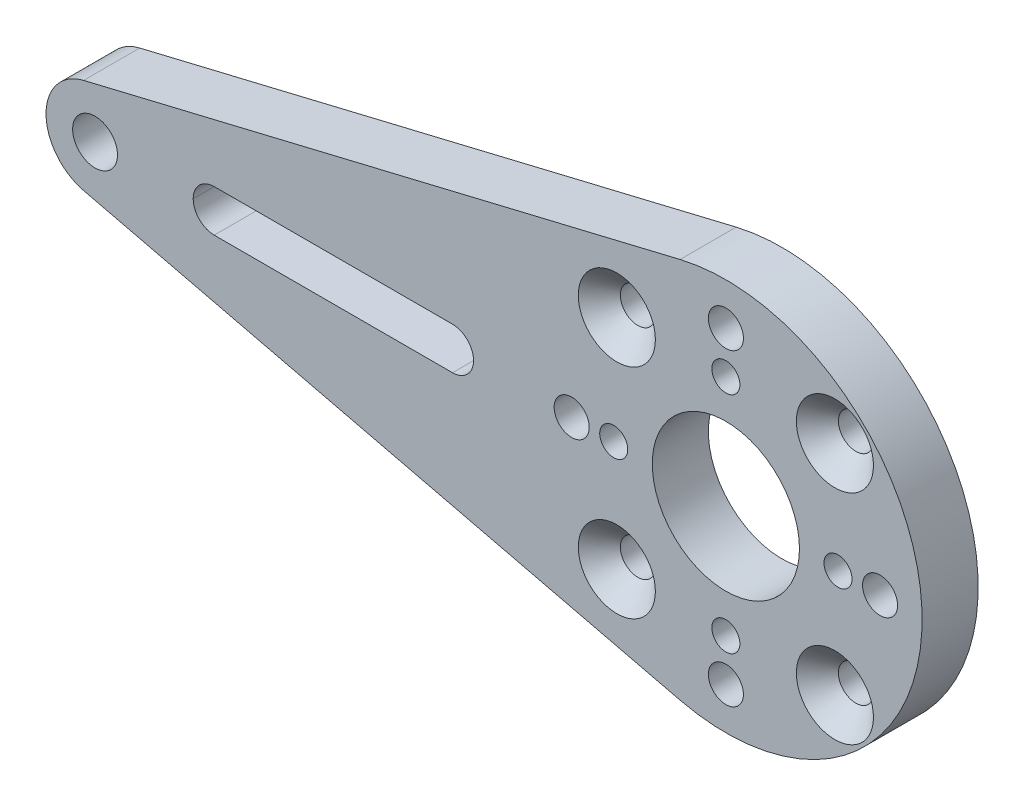
ISO-10303-21;
HEADER;
FILE_DESCRIPTION(('STEP AP214'),'2;1');
FILE_NAME('part.step','',(''),(''),'','','');
FILE_SCHEMA(('AUTOMOTIVE_DESIGN { 1 0 10303 214 1 1 1 1 }'));
ENDSEC;
DATA;
#1=APPLICATION_CONTEXT('core data for automotive mechanical design processes');
#2=APPLICATION_PROTOCOL_DEFINITION('international standard','automotive_design',2000,#1);
#3=PRODUCT_CONTEXT('',#1,'mechanical');
#4=PRODUCT('Part','Part','',(#3));
#5=PRODUCT_RELATED_PRODUCT_CATEGORY('part','',(#4));
#6=PRODUCT_DEFINITION_FORMATION('','',#4);
#7=PRODUCT_DEFINITION_CONTEXT('part definition',#1,'design');
#8=PRODUCT_DEFINITION('design','',#6,#7);
#9=PRODUCT_DEFINITION_SHAPE('','',#8);
#10=(LENGTH_UNIT() NAMED_UNIT(*) SI_UNIT(.MILLI.,.METRE.));
#11=(NAMED_UNIT(*) PLANE_ANGLE_UNIT() SI_UNIT($,.RADIAN.));
#12=(NAMED_UNIT(*) SI_UNIT($,.STERADIAN.) SOLID_ANGLE_UNIT());
#13=UNCERTAINTY_MEASURE_WITH_UNIT(LENGTH_MEASURE(1.E-05),#10,'distance_accuracy_value','');
#14=(GEOMETRIC_REPRESENTATION_CONTEXT(3) GLOBAL_UNCERTAINTY_ASSIGNED_CONTEXT((#13)) GLOBAL_UNIT_ASSIGNED_CONTEXT((#10,
#11,#12)) REPRESENTATION_CONTEXT('',''));
#15=CARTESIAN_POINT('',(0.,0.,0.));
#16=DIRECTION('',(0.,0.,1.));
#17=DIRECTION('',(1.,0.,0.));
#18=AXIS2_PLACEMENT_3D('',#15,#16,#17);
#19=CARTESIAN_POINT('',(0.,0.,4.));
#20=DIRECTION('',(0.,0.,1.));
#21=DIRECTION('',(1.,0.,0.));
#22=AXIS2_PLACEMENT_3D('',#19,#20,#21);
#23=PLANE('',#22);
#24=DIRECTION('',(1.,0.,0.));
#25=VECTOR('',#24,1.);
#26=CARTESIAN_POINT('',(-18.,-1.5,4.));
#27=LINE('',#26,#25);
#28=CARTESIAN_POINT('',(-36.5,-1.5,4.));
#29=VERTEX_POINT('',#28);
#30=CARTESIAN_POINT('',(-19.5,-1.5,4.));
#31=VERTEX_POINT('',#30);
#32=EDGE_CURVE('E195',#29,#31,#27,.T.);
#33=ORIENTED_EDGE('',*,*,#32,.F.);
#34=CARTESIAN_POINT('',(-36.5,0.,4.));
#35=DIRECTION('',(0.,0.,1.));
#36=DIRECTION('',(1.,0.,0.));
#37=AXIS2_PLACEMENT_3D('',#34,#35,#36);
#38=CIRCLE('',#37,1.5);
#39=CARTESIAN_POINT('',(-38.,0.,4.));
#40=VERTEX_POINT('',#39);
#41=EDGE_CURVE('E44',#29,#40,#38,.F.);
#42=ORIENTED_EDGE('',*,*,#41,.T.);
#43=CARTESIAN_POINT('',(-36.5,0.,4.));
#44=DIRECTION('',(0.,0.,1.));
#45=DIRECTION('',(1.,0.,0.));
#46=AXIS2_PLACEMENT_3D('',#43,#44,#45);
#47=CIRCLE('',#46,1.5);
#48=CARTESIAN_POINT('',(-36.5,1.5,4.));
#49=VERTEX_POINT('',#48);
#50=EDGE_CURVE('E185',#40,#49,#47,.F.);
#51=ORIENTED_EDGE('',*,*,#50,.T.);
#52=DIRECTION('',(-1.,0.,0.));
#53=VECTOR('',#52,1.);
#54=CARTESIAN_POINT('',(-18.,1.5,4.));
#55=LINE('',#54,#53);
#56=CARTESIAN_POINT('',(-19.5,1.5,4.));
#57=VERTEX_POINT('',#56);
#58=EDGE_CURVE('E214',#57,#49,#55,.T.);
#59=ORIENTED_EDGE('',*,*,#58,.F.);
#60=CARTESIAN_POINT('',(-19.5,0.,4.));
#61=DIRECTION('',(0.,0.,1.));
#62=DIRECTION('',(1.,0.,0.));
#63=AXIS2_PLACEMENT_3D('',#60,#61,#62);
#64=CIRCLE('',#63,1.5);
#65=CARTESIAN_POINT('',(-18.,0.,4.));
#66=VERTEX_POINT('',#65);
#67=EDGE_CURVE('E181',#57,#66,#64,.F.);
#68=ORIENTED_EDGE('',*,*,#67,.T.);
#69=CARTESIAN_POINT('',(-19.5,0.,4.));
#70=DIRECTION('',(0.,0.,1.));
#71=DIRECTION('',(1.,0.,0.));
#72=AXIS2_PLACEMENT_3D('',#69,#70,#71);
#73=CIRCLE('',#72,1.5);
#74=EDGE_CURVE('E177',#66,#31,#73,.F.);
#75=ORIENTED_EDGE('',*,*,#74,.T.);
#76=EDGE_LOOP('',(#33,#42,#51,#59,#68,#75));
#77=FACE_BOUND('',#76,.T.);
#78=CARTESIAN_POINT('',(7.77817459305193,7.77817459305212,4.));
#79=DIRECTION('',(0.,0.,1.));
#80=DIRECTION('',(1.,0.,0.));
#81=AXIS2_PLACEMENT_3D('',#78,#79,#80);
#82=CIRCLE('',#81,2.74999999999998);
#83=CARTESIAN_POINT('',(10.5281745930519,7.77817459305212,4.));
#84=VERTEX_POINT('',#83);
#85=EDGE_CURVE('E155',#84,#84,#82,.F.);
#86=ORIENTED_EDGE('',*,*,#85,.T.);
#87=EDGE_LOOP('',(#86));
#88=FACE_BOUND('',#87,.T.);
#89=CARTESIAN_POINT('',(7.77817459305209,-7.77817459305195,4.));
#90=DIRECTION('',(0.,0.,1.));
#91=DIRECTION('',(1.,0.,0.));
#92=AXIS2_PLACEMENT_3D('',#89,#90,#91);
#93=CIRCLE('',#92,2.74999999999999);
#94=CARTESIAN_POINT('',(10.5281745930521,-7.77817459305195,4.));
#95=VERTEX_POINT('',#94);
#96=EDGE_CURVE('E152',#95,#95,#93,.F.);
#97=ORIENTED_EDGE('',*,*,#96,.T.);
#98=EDGE_LOOP('',(#97));
#99=FACE_BOUND('',#98,.T.);
#100=CARTESIAN_POINT('',(-7.77817459305198,-7.77817459305206,4.));
#101=DIRECTION('',(0.,0.,1.));
#102=DIRECTION('',(1.,0.,0.));
#103=AXIS2_PLACEMENT_3D('',#100,#101,#102);
#104=CIRCLE('',#103,2.74999999999999);
#105=CARTESIAN_POINT('',(-5.02817459305199,-7.77817459305206,4.));
#106=VERTEX_POINT('',#105);
#107=EDGE_CURVE('E149',#106,#106,#104,.F.);
#108=ORIENTED_EDGE('',*,*,#107,.T.);
#109=EDGE_LOOP('',(#108));
#110=FACE_BOUND('',#109,.T.);
#111=CARTESIAN_POINT('',(-7.77817459305204,7.77817459305201,4.));
#112=DIRECTION('',(0.,0.,1.));
#113=DIRECTION('',(1.,0.,0.));
#114=AXIS2_PLACEMENT_3D('',#111,#112,#113);
#115=CIRCLE('',#114,2.74999999999999);
#116=CARTESIAN_POINT('',(-5.02817459305205,7.77817459305201,4.));
#117=VERTEX_POINT('',#116);
#118=EDGE_CURVE('E141',#117,#117,#115,.F.);
#119=ORIENTED_EDGE('',*,*,#118,.T.);
#120=EDGE_LOOP('',(#119));
#121=FACE_BOUND('',#120,.T.);
#122=CARTESIAN_POINT('',(-11.,0.,4.));
#123=DIRECTION('',(0.,0.,1.));
#124=DIRECTION('',(0.,1.,0.));
#125=AXIS2_PLACEMENT_3D('',#122,#123,#124);
#126=CIRCLE('',#125,1.25);
#127=CARTESIAN_POINT('',(-11.,1.24999999999996,4.));
#128=VERTEX_POINT('',#127);
#129=EDGE_CURVE('E229',#128,#128,#126,.T.);
#130=ORIENTED_EDGE('',*,*,#129,.F.);
#131=EDGE_LOOP('',(#130));
#132=FACE_BOUND('',#131,.T.);
#133=CARTESIAN_POINT('',(0.,-11.,4.));
#134=DIRECTION('',(0.,0.,1.));
#135=DIRECTION('',(-1.,0.,0.));
#136=AXIS2_PLACEMENT_3D('',#133,#134,#135);
#137=CIRCLE('',#136,1.25);
#138=CARTESIAN_POINT('',(-1.25,-11.,4.));
#139=VERTEX_POINT('',#138);
#140=EDGE_CURVE('E240',#139,#139,#137,.T.);
#141=ORIENTED_EDGE('',*,*,#140,.F.);
#142=EDGE_LOOP('',(#141));
#143=FACE_BOUND('',#142,.T.);
#144=CARTESIAN_POINT('',(11.,1.15218884181823E-13,4.));
#145=DIRECTION('',(0.,0.,1.));
#146=DIRECTION('',(0.,-1.,0.));
#147=AXIS2_PLACEMENT_3D('',#144,#145,#146);
#148=CIRCLE('',#147,1.25);
#149=CARTESIAN_POINT('',(11.,-1.24999999999988,4.));
#150=VERTEX_POINT('',#149);
#151=EDGE_CURVE('E217',#150,#150,#148,.T.);
#152=ORIENTED_EDGE('',*,*,#151,.F.);
#153=EDGE_LOOP('',(#152));
#154=FACE_BOUND('',#153,.T.);
#155=CARTESIAN_POINT('',(0.,11.,4.));
#156=DIRECTION('',(0.,0.,1.));
#157=DIRECTION('',(1.,0.,0.));
#158=AXIS2_PLACEMENT_3D('',#155,#156,#157);
#159=CIRCLE('',#158,1.25);
#160=CARTESIAN_POINT('',(1.25,11.,4.));
#161=VERTEX_POINT('',#160);
#162=EDGE_CURVE('E249',#161,#161,#159,.T.);
#163=ORIENTED_EDGE('',*,*,#162,.F.);
#164=EDGE_LOOP('',(#163));
#165=FACE_BOUND('',#164,.T.);
#166=CARTESIAN_POINT('',(-8.,0.,4.));
#167=DIRECTION('',(0.,0.,1.));
#168=DIRECTION('',(0.,1.,0.));
#169=AXIS2_PLACEMENT_3D('',#166,#167,#168);
#170=CIRCLE('',#169,1.);
#171=CARTESIAN_POINT('',(-8.,0.999999999999972,4.));
#172=VERTEX_POINT('',#171);
#173=EDGE_CURVE('E256',#172,#172,#170,.T.);
#174=ORIENTED_EDGE('',*,*,#173,.F.);
#175=EDGE_LOOP('',(#174));
#176=FACE_BOUND('',#175,.T.);
#177=CARTESIAN_POINT('',(0.,-8.,4.));
#178=DIRECTION('',(0.,0.,1.));
#179=DIRECTION('',(-1.,0.,0.));
#180=AXIS2_PLACEMENT_3D('',#177,#178,#179);
#181=CIRCLE('',#180,1.);
#182=CARTESIAN_POINT('',(-1.,-8.,4.));
#183=VERTEX_POINT('',#182);
#184=EDGE_CURVE('E264',#183,#183,#181,.T.);
#185=ORIENTED_EDGE('',*,*,#184,.F.);
#186=EDGE_LOOP('',(#185));
#187=FACE_BOUND('',#186,.T.);
#188=CARTESIAN_POINT('',(8.,0.,4.));
#189=DIRECTION('',(0.,0.,1.));
#190=DIRECTION('',(0.,-1.,0.));
#191=AXIS2_PLACEMENT_3D('',#188,#189,#190);
#192=CIRCLE('',#191,1.);
#193=CARTESIAN_POINT('',(8.00000000000001,-0.999999999999917,4.));
#194=VERTEX_POINT('',#193);
#195=EDGE_CURVE('E255',#194,#194,#192,.T.);
#196=ORIENTED_EDGE('',*,*,#195,.F.);
#197=EDGE_LOOP('',(#196));
#198=FACE_BOUND('',#197,.T.);
#199=CARTESIAN_POINT('',(0.,8.,4.));
#200=DIRECTION('',(0.,0.,1.));
#201=DIRECTION('',(1.,0.,0.));
#202=AXIS2_PLACEMENT_3D('',#199,#200,#201);
#203=CIRCLE('',#202,1.);
#204=CARTESIAN_POINT('',(1.,8.,4.));
#205=VERTEX_POINT('',#204);
#206=EDGE_CURVE('E263',#205,#205,#203,.T.);
#207=ORIENTED_EDGE('',*,*,#206,.F.);
#208=EDGE_LOOP('',(#207));
#209=FACE_BOUND('',#208,.T.);
#210=CARTESIAN_POINT('',(0.,0.,4.));
#211=DIRECTION('',(0.,0.,1.));
#212=DIRECTION('',(1.,0.,0.));
#213=AXIS2_PLACEMENT_3D('',#210,#211,#212);
#214=CIRCLE('',#213,5.25);
#215=CARTESIAN_POINT('',(5.25,0.,4.));
#216=VERTEX_POINT('',#215);
#217=EDGE_CURVE('E286',#216,#216,#214,.T.);
#218=ORIENTED_EDGE('',*,*,#217,.F.);
#219=EDGE_LOOP('',(#218));
#220=FACE_BOUND('',#219,.T.);
#221=CARTESIAN_POINT('',(0.,0.,4.));
#222=DIRECTION('',(0.,0.,1.));
#223=DIRECTION('',(1.,0.,0.));
#224=AXIS2_PLACEMENT_3D('',#221,#222,#223);
#225=CIRCLE('',#224,14.);
#226=CARTESIAN_POINT('',(-3.26666666666667,-13.6135553360938,4.));
#227=VERTEX_POINT('',#226);
#228=CARTESIAN_POINT('',(-3.26666666666667,13.6135553360938,4.));
#229=VERTEX_POINT('',#228);
#230=EDGE_CURVE('E124',#227,#229,#225,.T.);
#231=ORIENTED_EDGE('',*,*,#230,.T.);
#232=DIRECTION('',(-0.972396809720988,-0.233333333333333,0.));
#233=VECTOR('',#232,1.);
#234=CARTESIAN_POINT('',(-45.8166666666667,3.40338883402346,4.));
#235=LINE('',#234,#233);
#236=CARTESIAN_POINT('',(-45.8166666666667,3.40338883402346,4.));
#237=VERTEX_POINT('',#236);
#238=EDGE_CURVE('E113',#229,#237,#235,.T.);
#239=ORIENTED_EDGE('',*,*,#238,.T.);
#240=CARTESIAN_POINT('',(-45.,0.,4.));
#241=DIRECTION('',(0.,0.,1.));
#242=DIRECTION('',(1.,0.,0.));
#243=AXIS2_PLACEMENT_3D('',#240,#241,#242);
#244=CIRCLE('',#243,3.5);
#245=CARTESIAN_POINT('',(-45.8166666666667,-3.40338883402346,4.));
#246=VERTEX_POINT('',#245);
#247=EDGE_CURVE('E123',#237,#246,#244,.T.);
#248=ORIENTED_EDGE('',*,*,#247,.T.);
#249=DIRECTION('',(0.972396809720988,-0.233333333333333,0.));
#250=VECTOR('',#249,1.);
#251=CARTESIAN_POINT('',(-45.8166666666667,-3.40338883402346,4.));
#252=LINE('',#251,#250);
#253=EDGE_CURVE('E129',#246,#227,#252,.T.);
#254=ORIENTED_EDGE('',*,*,#253,.T.);
#255=EDGE_LOOP('',(#231,#239,#248,#254));
#256=FACE_BOUND('',#255,.T.);
#257=CARTESIAN_POINT('',(-45.,0.,4.));
#258=DIRECTION('',(0.,0.,1.));
#259=DIRECTION('',(1.,0.,0.));
#260=AXIS2_PLACEMENT_3D('',#257,#258,#259);
#261=CIRCLE('',#260,1.6);
#262=CARTESIAN_POINT('',(-43.4,0.,4.));
#263=VERTEX_POINT('',#262);
#264=EDGE_CURVE('E280',#263,#263,#261,.T.);
#265=ORIENTED_EDGE('',*,*,#264,.F.);
#266=EDGE_LOOP('',(#265));
#267=FACE_BOUND('',#266,.T.);
#268=ADVANCED_FACE('F35',(#77,#88,#99,#110,#121,#132,#143,#154,#165,#176,#187,#198,#209,#220,
#256,#267),#23,.T.);
#269=CARTESIAN_POINT('',(0.,0.,0.));
#270=DIRECTION('',(0.,0.,1.));
#271=DIRECTION('',(1.,0.,0.));
#272=AXIS2_PLACEMENT_3D('',#269,#270,#271);
#273=PLANE('',#272);
#274=CARTESIAN_POINT('',(-36.5,0.,0.));
#275=DIRECTION('',(0.,0.,1.));
#276=DIRECTION('',(1.,0.,0.));
#277=AXIS2_PLACEMENT_3D('',#274,#275,#276);
#278=CIRCLE('',#277,1.5);
#279=CARTESIAN_POINT('',(-36.5,1.5,0.));
#280=VERTEX_POINT('',#279);
#281=CARTESIAN_POINT('',(-38.,0.,0.));
#282=VERTEX_POINT('',#281);
#283=EDGE_CURVE('E51',#280,#282,#278,.T.);
#284=ORIENTED_EDGE('',*,*,#283,.T.);
#285=CARTESIAN_POINT('',(-36.5,0.,0.));
#286=DIRECTION('',(0.,0.,1.));
#287=DIRECTION('',(1.,0.,0.));
#288=AXIS2_PLACEMENT_3D('',#285,#286,#287);
#289=CIRCLE('',#288,1.5);
#290=CARTESIAN_POINT('',(-36.5,-1.5,0.));
#291=VERTEX_POINT('',#290);
#292=EDGE_CURVE('E11',#282,#291,#289,.T.);
#293=ORIENTED_EDGE('',*,*,#292,.T.);
#294=DIRECTION('',(-1.,0.,0.));
#295=VECTOR('',#294,1.);
#296=CARTESIAN_POINT('',(-18.,-1.5,0.));
#297=LINE('',#296,#295);
#298=CARTESIAN_POINT('',(-19.5,-1.5,0.));
#299=VERTEX_POINT('',#298);
#300=EDGE_CURVE('E208',#299,#291,#297,.T.);
#301=ORIENTED_EDGE('',*,*,#300,.F.);
#302=CARTESIAN_POINT('',(-19.5,0.,0.));
#303=DIRECTION('',(0.,0.,1.));
#304=DIRECTION('',(1.,0.,0.));
#305=AXIS2_PLACEMENT_3D('',#302,#303,#304);
#306=CIRCLE('',#305,1.5);
#307=CARTESIAN_POINT('',(-18.,0.,0.));
#308=VERTEX_POINT('',#307);
#309=EDGE_CURVE('E179',#299,#308,#306,.T.);
#310=ORIENTED_EDGE('',*,*,#309,.T.);
#311=CARTESIAN_POINT('',(-19.5,0.,0.));
#312=DIRECTION('',(0.,0.,1.));
#313=DIRECTION('',(1.,0.,0.));
#314=AXIS2_PLACEMENT_3D('',#311,#312,#313);
#315=CIRCLE('',#314,1.5);
#316=CARTESIAN_POINT('',(-19.5,1.5,0.));
#317=VERTEX_POINT('',#316);
#318=EDGE_CURVE('E183',#308,#317,#315,.T.);
#319=ORIENTED_EDGE('',*,*,#318,.T.);
#320=DIRECTION('',(1.,0.,0.));
#321=VECTOR('',#320,1.);
#322=CARTESIAN_POINT('',(-18.,1.5,0.));
#323=LINE('',#322,#321);
#324=EDGE_CURVE('E190',#280,#317,#323,.T.);
#325=ORIENTED_EDGE('',*,*,#324,.F.);
#326=EDGE_LOOP('',(#284,#293,#301,#310,#319,#325));
#327=FACE_BOUND('',#326,.T.);
#328=CARTESIAN_POINT('',(-11.,0.,0.));
#329=DIRECTION('',(0.,0.,1.));
#330=DIRECTION('',(1.,0.,0.));
#331=AXIS2_PLACEMENT_3D('',#328,#329,#330);
#332=CIRCLE('',#331,1.25);
#333=CARTESIAN_POINT('',(-9.75,0.,0.));
#334=VERTEX_POINT('',#333);
#335=EDGE_CURVE('E232',#334,#334,#332,.F.);
#336=ORIENTED_EDGE('',*,*,#335,.F.);
#337=EDGE_LOOP('',(#336));
#338=FACE_BOUND('',#337,.T.);
#339=CARTESIAN_POINT('',(-7.77817459305198,-7.77817459305206,0.));
#340=DIRECTION('',(0.,0.,1.));
#341=DIRECTION('',(1.,0.,0.));
#342=AXIS2_PLACEMENT_3D('',#339,#340,#341);
#343=CIRCLE('',#342,1.25);
#344=CARTESIAN_POINT('',(-6.52817459305198,-7.77817459305206,0.));
#345=VERTEX_POINT('',#344);
#346=EDGE_CURVE('E233',#345,#345,#343,.F.);
#347=ORIENTED_EDGE('',*,*,#346,.F.);
#348=EDGE_LOOP('',(#347));
#349=FACE_BOUND('',#348,.T.);
#350=CARTESIAN_POINT('',(0.,-11.,0.));
#351=DIRECTION('',(0.,0.,1.));
#352=DIRECTION('',(1.,0.,0.));
#353=AXIS2_PLACEMENT_3D('',#350,#351,#352);
#354=CIRCLE('',#353,1.25);
#355=CARTESIAN_POINT('',(1.25,-11.,0.));
#356=VERTEX_POINT('',#355);
#357=EDGE_CURVE('E239',#356,#356,#354,.F.);
#358=ORIENTED_EDGE('',*,*,#357,.F.);
#359=EDGE_LOOP('',(#358));
#360=FACE_BOUND('',#359,.T.);
#361=CARTESIAN_POINT('',(7.77817459305209,-7.77817459305195,0.));
#362=DIRECTION('',(0.,0.,1.));
#363=DIRECTION('',(1.,0.,0.));
#364=AXIS2_PLACEMENT_3D('',#361,#362,#363);
#365=CIRCLE('',#364,1.25);
#366=CARTESIAN_POINT('',(9.02817459305209,-7.77817459305195,0.));
#367=VERTEX_POINT('',#366);
#368=EDGE_CURVE('E227',#367,#367,#365,.F.);
#369=ORIENTED_EDGE('',*,*,#368,.F.);
#370=EDGE_LOOP('',(#369));
#371=FACE_BOUND('',#370,.T.);
#372=CARTESIAN_POINT('',(11.,1.15218884181823E-13,0.));
#373=DIRECTION('',(0.,0.,1.));
#374=DIRECTION('',(1.,0.,0.));
#375=AXIS2_PLACEMENT_3D('',#372,#373,#374);
#376=CIRCLE('',#375,1.25);
#377=CARTESIAN_POINT('',(12.25,1.15218884181823E-13,0.));
#378=VERTEX_POINT('',#377);
#379=EDGE_CURVE('E225',#378,#378,#376,.F.);
#380=ORIENTED_EDGE('',*,*,#379,.F.);
#381=EDGE_LOOP('',(#380));
#382=FACE_BOUND('',#381,.T.);
#383=CARTESIAN_POINT('',(7.77817459305193,7.77817459305212,0.));
#384=DIRECTION('',(0.,0.,1.));
#385=DIRECTION('',(1.,0.,0.));
#386=AXIS2_PLACEMENT_3D('',#383,#384,#385);
#387=CIRCLE('',#386,1.25);
#388=CARTESIAN_POINT('',(9.02817459305193,7.77817459305212,0.));
#389=VERTEX_POINT('',#388);
#390=EDGE_CURVE('E213',#389,#389,#387,.F.);
#391=ORIENTED_EDGE('',*,*,#390,.F.);
#392=EDGE_LOOP('',(#391));
#393=FACE_BOUND('',#392,.T.);
#394=CARTESIAN_POINT('',(-7.77817459305204,7.77817459305201,0.));
#395=DIRECTION('',(0.,0.,1.));
#396=DIRECTION('',(1.,0.,0.));
#397=AXIS2_PLACEMENT_3D('',#394,#395,#396);
#398=CIRCLE('',#397,1.25);
#399=CARTESIAN_POINT('',(-6.52817459305204,7.77817459305201,0.));
#400=VERTEX_POINT('',#399);
#401=EDGE_CURVE('E236',#400,#400,#398,.F.);
#402=ORIENTED_EDGE('',*,*,#401,.F.);
#403=EDGE_LOOP('',(#402));
#404=FACE_BOUND('',#403,.T.);
#405=CARTESIAN_POINT('',(0.,11.,0.));
#406=DIRECTION('',(0.,0.,1.));
#407=DIRECTION('',(1.,0.,0.));
#408=AXIS2_PLACEMENT_3D('',#405,#406,#407);
#409=CIRCLE('',#408,1.25);
#410=CARTESIAN_POINT('',(1.25,11.,0.));
#411=VERTEX_POINT('',#410);
#412=EDGE_CURVE('E252',#411,#411,#409,.F.);
#413=ORIENTED_EDGE('',*,*,#412,.F.);
#414=EDGE_LOOP('',(#413));
#415=FACE_BOUND('',#414,.T.);
#416=CARTESIAN_POINT('',(-8.,0.,0.));
#417=DIRECTION('',(0.,0.,1.));
#418=DIRECTION('',(1.,0.,0.));
#419=AXIS2_PLACEMENT_3D('',#416,#417,#418);
#420=CIRCLE('',#419,1.);
#421=CARTESIAN_POINT('',(-7.,0.,0.));
#422=VERTEX_POINT('',#421);
#423=EDGE_CURVE('E259',#422,#422,#420,.F.);
#424=ORIENTED_EDGE('',*,*,#423,.F.);
#425=EDGE_LOOP('',(#424));
#426=FACE_BOUND('',#425,.T.);
#427=CARTESIAN_POINT('',(0.,-8.,0.));
#428=DIRECTION('',(0.,0.,1.));
#429=DIRECTION('',(1.,0.,0.));
#430=AXIS2_PLACEMENT_3D('',#427,#428,#429);
#431=CIRCLE('',#430,1.);
#432=CARTESIAN_POINT('',(1.,-8.,0.));
#433=VERTEX_POINT('',#432);
#434=EDGE_CURVE('E260',#433,#433,#431,.F.);
#435=ORIENTED_EDGE('',*,*,#434,.F.);
#436=EDGE_LOOP('',(#435));
#437=FACE_BOUND('',#436,.T.);
#438=CARTESIAN_POINT('',(8.,0.,0.));
#439=DIRECTION('',(0.,0.,1.));
#440=DIRECTION('',(1.,0.,0.));
#441=AXIS2_PLACEMENT_3D('',#438,#439,#440);
#442=CIRCLE('',#441,1.);
#443=CARTESIAN_POINT('',(9.,0.,0.));
#444=VERTEX_POINT('',#443);
#445=EDGE_CURVE('E267',#444,#444,#442,.F.);
#446=ORIENTED_EDGE('',*,*,#445,.F.);
#447=EDGE_LOOP('',(#446));
#448=FACE_BOUND('',#447,.T.);
#449=CARTESIAN_POINT('',(0.,8.,0.));
#450=DIRECTION('',(0.,0.,1.));
#451=DIRECTION('',(1.,0.,0.));
#452=AXIS2_PLACEMENT_3D('',#449,#450,#451);
#453=CIRCLE('',#452,1.);
#454=CARTESIAN_POINT('',(1.,8.,0.));
#455=VERTEX_POINT('',#454);
#456=EDGE_CURVE('E276',#455,#455,#453,.F.);
#457=ORIENTED_EDGE('',*,*,#456,.F.);
#458=EDGE_LOOP('',(#457));
#459=FACE_BOUND('',#458,.T.);
#460=CARTESIAN_POINT('',(0.,0.,0.));
#461=DIRECTION('',(0.,0.,1.));
#462=DIRECTION('',(1.,0.,0.));
#463=AXIS2_PLACEMENT_3D('',#460,#461,#462);
#464=CIRCLE('',#463,14.);
#465=CARTESIAN_POINT('',(-3.26666666666667,-13.6135553360938,0.));
#466=VERTEX_POINT('',#465);
#467=CARTESIAN_POINT('',(-3.26666666666667,13.6135553360938,0.));
#468=VERTEX_POINT('',#467);
#469=EDGE_CURVE('E137',#466,#468,#464,.T.);
#470=ORIENTED_EDGE('',*,*,#469,.F.);
#471=DIRECTION('',(0.972396809720988,-0.233333333333333,0.));
#472=VECTOR('',#471,1.);
#473=CARTESIAN_POINT('',(-45.8166666666667,-3.40338883402346,0.));
#474=LINE('',#473,#472);
#475=CARTESIAN_POINT('',(-45.8166666666667,-3.40338883402346,0.));
#476=VERTEX_POINT('',#475);
#477=EDGE_CURVE('E133',#476,#466,#474,.T.);
#478=ORIENTED_EDGE('',*,*,#477,.F.);
#479=CARTESIAN_POINT('',(-45.,0.,0.));
#480=DIRECTION('',(0.,0.,1.));
#481=DIRECTION('',(1.,0.,0.));
#482=AXIS2_PLACEMENT_3D('',#479,#480,#481);
#483=CIRCLE('',#482,3.5);
#484=CARTESIAN_POINT('',(-45.8166666666667,3.40338883402346,0.));
#485=VERTEX_POINT('',#484);
#486=EDGE_CURVE('E297',#485,#476,#483,.T.);
#487=ORIENTED_EDGE('',*,*,#486,.F.);
#488=DIRECTION('',(-0.972396809720988,-0.233333333333333,0.));
#489=VECTOR('',#488,1.);
#490=CARTESIAN_POINT('',(-45.8166666666667,3.40338883402346,0.));
#491=LINE('',#490,#489);
#492=EDGE_CURVE('E295',#468,#485,#491,.T.);
#493=ORIENTED_EDGE('',*,*,#492,.F.);
#494=EDGE_LOOP('',(#470,#478,#487,#493));
#495=FACE_BOUND('',#494,.T.);
#496=CARTESIAN_POINT('',(0.,0.,0.));
#497=DIRECTION('',(0.,0.,1.));
#498=DIRECTION('',(1.,0.,0.));
#499=AXIS2_PLACEMENT_3D('',#496,#497,#498);
#500=CIRCLE('',#499,5.25);
#501=CARTESIAN_POINT('',(5.25,0.,0.));
#502=VERTEX_POINT('',#501);
#503=EDGE_CURVE('E283',#502,#502,#500,.T.);
#504=ORIENTED_EDGE('',*,*,#503,.T.);
#505=EDGE_LOOP('',(#504));
#506=FACE_BOUND('',#505,.T.);
#507=CARTESIAN_POINT('',(-45.,0.,0.));
#508=DIRECTION('',(0.,0.,1.));
#509=DIRECTION('',(1.,0.,0.));
#510=AXIS2_PLACEMENT_3D('',#507,#508,#509);
#511=CIRCLE('',#510,1.6);
#512=CARTESIAN_POINT('',(-43.4,0.,0.));
#513=VERTEX_POINT('',#512);
#514=EDGE_CURVE('E279',#513,#513,#511,.T.);
#515=ORIENTED_EDGE('',*,*,#514,.T.);
#516=EDGE_LOOP('',(#515));
#517=FACE_BOUND('',#516,.T.);
#518=ADVANCED_FACE('F206',(#327,#338,#349,#360,#371,#382,#393,#404,#415,#426,#437,#448,#459,
#495,#506,#517),#273,.F.);
#519=CARTESIAN_POINT('',(0.,0.,4.));
#520=DIRECTION('',(0.,0.,-1.));
#521=DIRECTION('',(-1.,0.,0.));
#522=AXIS2_PLACEMENT_3D('',#519,#520,#521);
#523=CYLINDRICAL_SURFACE('',#522,14.);
#524=ORIENTED_EDGE('',*,*,#469,.T.);
#525=DIRECTION('',(0.,0.,-1.));
#526=VECTOR('',#525,1.);
#527=CARTESIAN_POINT('',(-3.26666666666667,13.6135553360938,4.));
#528=LINE('',#527,#526);
#529=EDGE_CURVE('E117',#229,#468,#528,.T.);
#530=ORIENTED_EDGE('',*,*,#529,.F.);
#531=ORIENTED_EDGE('',*,*,#230,.F.);
#532=DIRECTION('',(0.,0.,-1.));
#533=VECTOR('',#532,1.);
#534=CARTESIAN_POINT('',(-3.26666666666667,-13.6135553360938,4.));
#535=LINE('',#534,#533);
#536=EDGE_CURVE('E293',#227,#466,#535,.T.);
#537=ORIENTED_EDGE('',*,*,#536,.T.);
#538=EDGE_LOOP('',(#524,#530,#531,#537));
#539=FACE_BOUND('',#538,.T.);
#540=ADVANCED_FACE('F135',(#539),#523,.T.);
#541=CARTESIAN_POINT('',(-45.8166666666667,3.40338883402346,4.));
#542=DIRECTION('',(0.233333333333333,-0.972396809720988,0.));
#543=DIRECTION('',(0.972396809720988,0.233333333333333,0.));
#544=AXIS2_PLACEMENT_3D('',#541,#542,#543);
#545=PLANE('',#544);
#546=ORIENTED_EDGE('',*,*,#492,.T.);
#547=DIRECTION('',(0.,0.,-1.));
#548=VECTOR('',#547,1.);
#549=CARTESIAN_POINT('',(-45.8166666666667,3.40338883402346,4.));
#550=LINE('',#549,#548);
#551=EDGE_CURVE('E120',#237,#485,#550,.T.);
#552=ORIENTED_EDGE('',*,*,#551,.F.);
#553=ORIENTED_EDGE('',*,*,#238,.F.);
#554=ORIENTED_EDGE('',*,*,#529,.T.);
#555=EDGE_LOOP('',(#546,#552,#553,#554));
#556=FACE_BOUND('',#555,.T.);
#557=ADVANCED_FACE('F115',(#556),#545,.F.);
#558=CARTESIAN_POINT('',(-45.,0.,4.));
#559=DIRECTION('',(0.,0.,-1.));
#560=DIRECTION('',(-1.,0.,0.));
#561=AXIS2_PLACEMENT_3D('',#558,#559,#560);
#562=CYLINDRICAL_SURFACE('',#561,3.5);
#563=ORIENTED_EDGE('',*,*,#486,.T.);
#564=DIRECTION('',(0.,0.,-1.));
#565=VECTOR('',#564,1.);
#566=CARTESIAN_POINT('',(-45.8166666666667,-3.40338883402346,4.));
#567=LINE('',#566,#565);
#568=EDGE_CURVE('E143',#246,#476,#567,.T.);
#569=ORIENTED_EDGE('',*,*,#568,.F.);
#570=ORIENTED_EDGE('',*,*,#247,.F.);
#571=ORIENTED_EDGE('',*,*,#551,.T.);
#572=EDGE_LOOP('',(#563,#569,#570,#571));
#573=FACE_BOUND('',#572,.T.);
#574=ADVANCED_FACE('F309',(#573),#562,.T.);
#575=CARTESIAN_POINT('',(-45.8166666666667,-3.40338883402346,4.));
#576=DIRECTION('',(0.233333333333333,0.972396809720988,0.));
#577=DIRECTION('',(-0.972396809720988,0.233333333333333,0.));
#578=AXIS2_PLACEMENT_3D('',#575,#576,#577);
#579=PLANE('',#578);
#580=ORIENTED_EDGE('',*,*,#477,.T.);
#581=ORIENTED_EDGE('',*,*,#536,.F.);
#582=ORIENTED_EDGE('',*,*,#253,.F.);
#583=ORIENTED_EDGE('',*,*,#568,.T.);
#584=EDGE_LOOP('',(#580,#581,#582,#583));
#585=FACE_BOUND('',#584,.T.);
#586=ADVANCED_FACE('F304',(#585),#579,.F.);
#587=CARTESIAN_POINT('',(0.,0.,4.));
#588=DIRECTION('',(0.,0.,-1.));
#589=DIRECTION('',(-1.,0.,0.));
#590=AXIS2_PLACEMENT_3D('',#587,#588,#589);
#591=CYLINDRICAL_SURFACE('',#590,5.25);
#592=ORIENTED_EDGE('',*,*,#217,.T.);
#593=EDGE_LOOP('',(#592));
#594=FACE_BOUND('',#593,.T.);
#595=ORIENTED_EDGE('',*,*,#503,.F.);
#596=EDGE_LOOP('',(#595));
#597=FACE_BOUND('',#596,.T.);
#598=ADVANCED_FACE('F316',(#594,#597),#591,.F.);
#599=CARTESIAN_POINT('',(-45.,0.,4.));
#600=DIRECTION('',(0.,0.,-1.));
#601=DIRECTION('',(-1.,0.,0.));
#602=AXIS2_PLACEMENT_3D('',#599,#600,#601);
#603=CYLINDRICAL_SURFACE('',#602,1.6);
#604=ORIENTED_EDGE('',*,*,#264,.T.);
#605=EDGE_LOOP('',(#604));
#606=FACE_BOUND('',#605,.T.);
#607=ORIENTED_EDGE('',*,*,#514,.F.);
#608=EDGE_LOOP('',(#607));
#609=FACE_BOUND('',#608,.T.);
#610=ADVANCED_FACE('F329',(#606,#609),#603,.F.);
#611=CARTESIAN_POINT('',(0.,8.,-0.00100000000000013));
#612=DIRECTION('',(0.,0.,1.));
#613=DIRECTION('',(1.,0.,0.));
#614=AXIS2_PLACEMENT_3D('',#611,#612,#613);
#615=CYLINDRICAL_SURFACE('',#614,1.);
#616=ORIENTED_EDGE('',*,*,#206,.T.);
#617=EDGE_LOOP('',(#616));
#618=FACE_BOUND('',#617,.T.);
#619=ORIENTED_EDGE('',*,*,#456,.T.);
#620=EDGE_LOOP('',(#619));
#621=FACE_BOUND('',#620,.T.);
#622=ADVANCED_FACE('F333',(#618,#621),#615,.F.);
#623=CARTESIAN_POINT('',(8.,0.,-0.00100000000000013));
#624=DIRECTION('',(0.,0.,1.));
#625=DIRECTION('',(1.,0.,0.));
#626=AXIS2_PLACEMENT_3D('',#623,#624,#625);
#627=CYLINDRICAL_SURFACE('',#626,1.);
#628=ORIENTED_EDGE('',*,*,#195,.T.);
#629=EDGE_LOOP('',(#628));
#630=FACE_BOUND('',#629,.T.);
#631=ORIENTED_EDGE('',*,*,#445,.T.);
#632=EDGE_LOOP('',(#631));
#633=FACE_BOUND('',#632,.T.);
#634=ADVANCED_FACE('F337',(#630,#633),#627,.F.);
#635=CARTESIAN_POINT('',(0.,-8.,-0.00100000000000013));
#636=DIRECTION('',(0.,0.,1.));
#637=DIRECTION('',(1.,0.,0.));
#638=AXIS2_PLACEMENT_3D('',#635,#636,#637);
#639=CYLINDRICAL_SURFACE('',#638,1.);
#640=ORIENTED_EDGE('',*,*,#184,.T.);
#641=EDGE_LOOP('',(#640));
#642=FACE_BOUND('',#641,.T.);
#643=ORIENTED_EDGE('',*,*,#434,.T.);
#644=EDGE_LOOP('',(#643));
#645=FACE_BOUND('',#644,.T.);
#646=ADVANCED_FACE('F341',(#642,#645),#639,.F.);
#647=CARTESIAN_POINT('',(-8.,0.,-0.00100000000000013));
#648=DIRECTION('',(0.,0.,1.));
#649=DIRECTION('',(1.,0.,0.));
#650=AXIS2_PLACEMENT_3D('',#647,#648,#649);
#651=CYLINDRICAL_SURFACE('',#650,1.);
#652=ORIENTED_EDGE('',*,*,#173,.T.);
#653=EDGE_LOOP('',(#652));
#654=FACE_BOUND('',#653,.T.);
#655=ORIENTED_EDGE('',*,*,#423,.T.);
#656=EDGE_LOOP('',(#655));
#657=FACE_BOUND('',#656,.T.);
#658=ADVANCED_FACE('F345',(#654,#657),#651,.F.);
#659=CARTESIAN_POINT('',(0.,11.,-0.00100000000000013));
#660=DIRECTION('',(0.,0.,1.));
#661=DIRECTION('',(1.,0.,0.));
#662=AXIS2_PLACEMENT_3D('',#659,#660,#661);
#663=CYLINDRICAL_SURFACE('',#662,1.25);
#664=ORIENTED_EDGE('',*,*,#162,.T.);
#665=EDGE_LOOP('',(#664));
#666=FACE_BOUND('',#665,.T.);
#667=ORIENTED_EDGE('',*,*,#412,.T.);
#668=EDGE_LOOP('',(#667));
#669=FACE_BOUND('',#668,.T.);
#670=ADVANCED_FACE('F349',(#666,#669),#663,.F.);
#671=CARTESIAN_POINT('',(-7.77817459305204,7.77817459305201,-0.00100000000000013));
#672=DIRECTION('',(0.,0.,1.));
#673=DIRECTION('',(1.,0.,0.));
#674=AXIS2_PLACEMENT_3D('',#671,#672,#673);
#675=CYLINDRICAL_SURFACE('',#674,1.25);
#676=CARTESIAN_POINT('',(-7.77817459305204,7.77817459305201,2.50000000000002));
#677=DIRECTION('',(0.,0.,1.));
#678=DIRECTION('',(1.,0.,0.));
#679=AXIS2_PLACEMENT_3D('',#676,#677,#678);
#680=CIRCLE('',#679,1.25);
#681=CARTESIAN_POINT('',(-6.52817459305204,7.77817459305201,2.50000000000002));
#682=VERTEX_POINT('',#681);
#683=EDGE_CURVE('E164',#682,#682,#680,.T.);
#684=ORIENTED_EDGE('',*,*,#683,.T.);
#685=EDGE_LOOP('',(#684));
#686=FACE_BOUND('',#685,.T.);
#687=ORIENTED_EDGE('',*,*,#401,.T.);
#688=EDGE_LOOP('',(#687));
#689=FACE_BOUND('',#688,.T.);
#690=ADVANCED_FACE('F353',(#686,#689),#675,.F.);
#691=CARTESIAN_POINT('',(7.77817459305193,7.77817459305212,-0.00100000000000013));
#692=DIRECTION('',(0.,0.,1.));
#693=DIRECTION('',(1.,0.,0.));
#694=AXIS2_PLACEMENT_3D('',#691,#692,#693);
#695=CYLINDRICAL_SURFACE('',#694,1.25);
#696=CARTESIAN_POINT('',(7.77817459305193,7.77817459305212,2.50000000000002));
#697=DIRECTION('',(0.,0.,1.));
#698=DIRECTION('',(1.,0.,0.));
#699=AXIS2_PLACEMENT_3D('',#696,#697,#698);
#700=CIRCLE('',#699,1.25);
#701=CARTESIAN_POINT('',(9.02817459305193,7.77817459305212,2.50000000000002));
#702=VERTEX_POINT('',#701);
#703=EDGE_CURVE('E138',#702,#702,#700,.T.);
#704=ORIENTED_EDGE('',*,*,#703,.T.);
#705=EDGE_LOOP('',(#704));
#706=FACE_BOUND('',#705,.T.);
#707=ORIENTED_EDGE('',*,*,#390,.T.);
#708=EDGE_LOOP('',(#707));
#709=FACE_BOUND('',#708,.T.);
#710=ADVANCED_FACE('F357',(#706,#709),#695,.F.);
#711=CARTESIAN_POINT('',(11.,1.15218884181823E-13,-0.00100000000000013));
#712=DIRECTION('',(0.,0.,1.));
#713=DIRECTION('',(1.,0.,0.));
#714=AXIS2_PLACEMENT_3D('',#711,#712,#713);
#715=CYLINDRICAL_SURFACE('',#714,1.25);
#716=ORIENTED_EDGE('',*,*,#151,.T.);
#717=EDGE_LOOP('',(#716));
#718=FACE_BOUND('',#717,.T.);
#719=ORIENTED_EDGE('',*,*,#379,.T.);
#720=EDGE_LOOP('',(#719));
#721=FACE_BOUND('',#720,.T.);
#722=ADVANCED_FACE('F363',(#718,#721),#715,.F.);
#723=CARTESIAN_POINT('',(7.77817459305209,-7.77817459305195,-0.00100000000000013));
#724=DIRECTION('',(0.,0.,1.));
#725=DIRECTION('',(1.,0.,0.));
#726=AXIS2_PLACEMENT_3D('',#723,#724,#725);
#727=CYLINDRICAL_SURFACE('',#726,1.25);
#728=CARTESIAN_POINT('',(7.77817459305209,-7.77817459305195,2.50000000000002));
#729=DIRECTION('',(0.,0.,1.));
#730=DIRECTION('',(1.,0.,0.));
#731=AXIS2_PLACEMENT_3D('',#728,#729,#730);
#732=CIRCLE('',#731,1.25);
#733=CARTESIAN_POINT('',(9.02817459305209,-7.77817459305195,2.50000000000002));
#734=VERTEX_POINT('',#733);
#735=EDGE_CURVE('E158',#734,#734,#732,.T.);
#736=ORIENTED_EDGE('',*,*,#735,.T.);
#737=EDGE_LOOP('',(#736));
#738=FACE_BOUND('',#737,.T.);
#739=ORIENTED_EDGE('',*,*,#368,.T.);
#740=EDGE_LOOP('',(#739));
#741=FACE_BOUND('',#740,.T.);
#742=ADVANCED_FACE('F359',(#738,#741),#727,.F.);
#743=CARTESIAN_POINT('',(0.,-11.,-0.00100000000000013));
#744=DIRECTION('',(0.,0.,1.));
#745=DIRECTION('',(1.,0.,0.));
#746=AXIS2_PLACEMENT_3D('',#743,#744,#745);
#747=CYLINDRICAL_SURFACE('',#746,1.25);
#748=ORIENTED_EDGE('',*,*,#140,.T.);
#749=EDGE_LOOP('',(#748));
#750=FACE_BOUND('',#749,.T.);
#751=ORIENTED_EDGE('',*,*,#357,.T.);
#752=EDGE_LOOP('',(#751));
#753=FACE_BOUND('',#752,.T.);
#754=ADVANCED_FACE('F362',(#750,#753),#747,.F.);
#755=CARTESIAN_POINT('',(-7.77817459305198,-7.77817459305206,-0.00100000000000013));
#756=DIRECTION('',(0.,0.,1.));
#757=DIRECTION('',(1.,0.,0.));
#758=AXIS2_PLACEMENT_3D('',#755,#756,#757);
#759=CYLINDRICAL_SURFACE('',#758,1.25);
#760=CARTESIAN_POINT('',(-7.77817459305198,-7.77817459305206,2.50000000000002));
#761=DIRECTION('',(0.,0.,1.));
#762=DIRECTION('',(1.,0.,0.));
#763=AXIS2_PLACEMENT_3D('',#760,#761,#762);
#764=CIRCLE('',#763,1.25);
#765=CARTESIAN_POINT('',(-6.52817459305198,-7.77817459305206,2.50000000000002));
#766=VERTEX_POINT('',#765);
#767=EDGE_CURVE('E161',#766,#766,#764,.T.);
#768=ORIENTED_EDGE('',*,*,#767,.T.);
#769=EDGE_LOOP('',(#768));
#770=FACE_BOUND('',#769,.T.);
#771=ORIENTED_EDGE('',*,*,#346,.T.);
#772=EDGE_LOOP('',(#771));
#773=FACE_BOUND('',#772,.T.);
#774=ADVANCED_FACE('F367',(#770,#773),#759,.F.);
#775=CARTESIAN_POINT('',(-11.,0.,-0.00100000000000013));
#776=DIRECTION('',(0.,0.,1.));
#777=DIRECTION('',(1.,0.,0.));
#778=AXIS2_PLACEMENT_3D('',#775,#776,#777);
#779=CYLINDRICAL_SURFACE('',#778,1.25);
#780=ORIENTED_EDGE('',*,*,#129,.T.);
#781=EDGE_LOOP('',(#780));
#782=FACE_BOUND('',#781,.T.);
#783=ORIENTED_EDGE('',*,*,#335,.T.);
#784=EDGE_LOOP('',(#783));
#785=FACE_BOUND('',#784,.T.);
#786=ADVANCED_FACE('F371',(#782,#785),#779,.F.);
#787=CARTESIAN_POINT('',(7.77817459305193,7.77817459305212,2.50000000000002));
#788=DIRECTION('',(0.,0.,1.));
#789=DIRECTION('',(1.,0.,0.));
#790=AXIS2_PLACEMENT_3D('',#787,#788,#789);
#791=CONICAL_SURFACE('',#790,1.25,0.78539816339745);
#792=ORIENTED_EDGE('',*,*,#85,.F.);
#793=EDGE_LOOP('',(#792));
#794=FACE_BOUND('',#793,.T.);
#795=ORIENTED_EDGE('',*,*,#703,.F.);
#796=EDGE_LOOP('',(#795));
#797=FACE_BOUND('',#796,.T.);
#798=ADVANCED_FACE('F375',(#794,#797),#791,.F.);
#799=CARTESIAN_POINT('',(7.77817459305209,-7.77817459305195,2.50000000000002));
#800=DIRECTION('',(0.,0.,1.));
#801=DIRECTION('',(1.,0.,0.));
#802=AXIS2_PLACEMENT_3D('',#799,#800,#801);
#803=CONICAL_SURFACE('',#802,1.25,0.785398163397451);
#804=ORIENTED_EDGE('',*,*,#96,.F.);
#805=EDGE_LOOP('',(#804));
#806=FACE_BOUND('',#805,.T.);
#807=ORIENTED_EDGE('',*,*,#735,.F.);
#808=EDGE_LOOP('',(#807));
#809=FACE_BOUND('',#808,.T.);
#810=ADVANCED_FACE('F465',(#806,#809),#803,.F.);
#811=CARTESIAN_POINT('',(-7.77817459305198,-7.77817459305206,2.50000000000002));
#812=DIRECTION('',(0.,0.,1.));
#813=DIRECTION('',(1.,0.,0.));
#814=AXIS2_PLACEMENT_3D('',#811,#812,#813);
#815=CONICAL_SURFACE('',#814,1.25,0.78539816339745);
#816=ORIENTED_EDGE('',*,*,#107,.F.);
#817=EDGE_LOOP('',(#816));
#818=FACE_BOUND('',#817,.T.);
#819=ORIENTED_EDGE('',*,*,#767,.F.);
#820=EDGE_LOOP('',(#819));
#821=FACE_BOUND('',#820,.T.);
#822=ADVANCED_FACE('F393',(#818,#821),#815,.F.);
#823=CARTESIAN_POINT('',(-7.77817459305204,7.77817459305201,2.50000000000002));
#824=DIRECTION('',(0.,0.,1.));
#825=DIRECTION('',(1.,0.,0.));
#826=AXIS2_PLACEMENT_3D('',#823,#824,#825);
#827=CONICAL_SURFACE('',#826,1.25,0.785398163397451);
#828=ORIENTED_EDGE('',*,*,#118,.F.);
#829=EDGE_LOOP('',(#828));
#830=FACE_BOUND('',#829,.T.);
#831=ORIENTED_EDGE('',*,*,#683,.F.);
#832=EDGE_LOOP('',(#831));
#833=FACE_BOUND('',#832,.T.);
#834=ADVANCED_FACE('F388',(#830,#833),#827,.F.);
#835=CARTESIAN_POINT('',(-18.,1.5,-0.00100000000000013));
#836=DIRECTION('',(0.,1.,0.));
#837=DIRECTION('',(-1.,0.,0.));
#838=AXIS2_PLACEMENT_3D('',#835,#836,#837);
#839=PLANE('',#838);
#840=ORIENTED_EDGE('',*,*,#324,.T.);
#841=DIRECTION('',(0.,0.,1.));
#842=VECTOR('',#841,1.);
#843=CARTESIAN_POINT('',(-19.5,1.5,4.));
#844=LINE('',#843,#842);
#845=EDGE_CURVE('E175',#317,#57,#844,.T.);
#846=ORIENTED_EDGE('',*,*,#845,.T.);
#847=ORIENTED_EDGE('',*,*,#58,.T.);
#848=DIRECTION('',(0.,0.,1.));
#849=VECTOR('',#848,1.);
#850=CARTESIAN_POINT('',(-36.5,1.5,0.));
#851=LINE('',#850,#849);
#852=EDGE_CURVE('E172',#49,#280,#851,.F.);
#853=ORIENTED_EDGE('',*,*,#852,.T.);
#854=EDGE_LOOP('',(#840,#846,#847,#853));
#855=FACE_BOUND('',#854,.T.);
#856=ADVANCED_FACE('F386',(#855),#839,.F.);
#857=CARTESIAN_POINT('',(-18.,-1.5,-0.00100000000000013));
#858=DIRECTION('',(0.,-1.,0.));
#859=DIRECTION('',(1.,0.,0.));
#860=AXIS2_PLACEMENT_3D('',#857,#858,#859);
#861=PLANE('',#860);
#862=ORIENTED_EDGE('',*,*,#32,.T.);
#863=DIRECTION('',(0.,0.,1.));
#864=VECTOR('',#863,1.);
#865=CARTESIAN_POINT('',(-19.5,-1.5,0.));
#866=LINE('',#865,#864);
#867=EDGE_CURVE('E169',#31,#299,#866,.F.);
#868=ORIENTED_EDGE('',*,*,#867,.T.);
#869=ORIENTED_EDGE('',*,*,#300,.T.);
#870=DIRECTION('',(0.,0.,1.));
#871=VECTOR('',#870,1.);
#872=CARTESIAN_POINT('',(-36.5,-1.5,4.));
#873=LINE('',#872,#871);
#874=EDGE_CURVE('E167',#291,#29,#873,.T.);
#875=ORIENTED_EDGE('',*,*,#874,.T.);
#876=EDGE_LOOP('',(#862,#868,#869,#875));
#877=FACE_BOUND('',#876,.T.);
#878=ADVANCED_FACE('F211',(#877),#861,.F.);
#879=CARTESIAN_POINT('',(-19.5,0.,-0.00100000000000013));
#880=DIRECTION('',(0.,0.,-1.));
#881=DIRECTION('',(-1.,0.,0.));
#882=AXIS2_PLACEMENT_3D('',#879,#880,#881);
#883=CYLINDRICAL_SURFACE('',#882,1.5);
#884=ORIENTED_EDGE('',*,*,#845,.F.);
#885=ORIENTED_EDGE('',*,*,#318,.F.);
#886=DIRECTION('',(0.,0.,1.));
#887=VECTOR('',#886,1.);
#888=CARTESIAN_POINT('',(-18.,0.,0.));
#889=LINE('',#888,#887);
#890=EDGE_CURVE('E188',#66,#308,#889,.F.);
#891=ORIENTED_EDGE('',*,*,#890,.F.);
#892=ORIENTED_EDGE('',*,*,#67,.F.);
#893=EDGE_LOOP('',(#884,#885,#891,#892));
#894=FACE_BOUND('',#893,.T.);
#895=ADVANCED_FACE('F385',(#894),#883,.F.);
#896=CARTESIAN_POINT('',(-19.5,0.,-0.00100000000000013));
#897=DIRECTION('',(0.,0.,-1.));
#898=DIRECTION('',(-1.,0.,0.));
#899=AXIS2_PLACEMENT_3D('',#896,#897,#898);
#900=CYLINDRICAL_SURFACE('',#899,1.5);
#901=ORIENTED_EDGE('',*,*,#309,.F.);
#902=ORIENTED_EDGE('',*,*,#867,.F.);
#903=ORIENTED_EDGE('',*,*,#74,.F.);
#904=ORIENTED_EDGE('',*,*,#890,.T.);
#905=EDGE_LOOP('',(#901,#902,#903,#904));
#906=FACE_BOUND('',#905,.T.);
#907=ADVANCED_FACE('F401',(#906),#900,.F.);
#908=CARTESIAN_POINT('',(-36.5,0.,-0.00100000000000013));
#909=DIRECTION('',(0.,0.,-1.));
#910=DIRECTION('',(-1.,0.,0.));
#911=AXIS2_PLACEMENT_3D('',#908,#909,#910);
#912=CYLINDRICAL_SURFACE('',#911,1.5);
#913=ORIENTED_EDGE('',*,*,#874,.F.);
#914=ORIENTED_EDGE('',*,*,#292,.F.);
#915=DIRECTION('',(0.,0.,1.));
#916=VECTOR('',#915,1.);
#917=CARTESIAN_POINT('',(-38.,0.,0.));
#918=LINE('',#917,#916);
#919=EDGE_CURVE('E39',#40,#282,#918,.F.);
#920=ORIENTED_EDGE('',*,*,#919,.F.);
#921=ORIENTED_EDGE('',*,*,#41,.F.);
#922=EDGE_LOOP('',(#913,#914,#920,#921));
#923=FACE_BOUND('',#922,.T.);
#924=ADVANCED_FACE('F37',(#923),#912,.F.);
#925=CARTESIAN_POINT('',(-36.5,0.,-0.00100000000000013));
#926=DIRECTION('',(0.,0.,-1.));
#927=DIRECTION('',(-1.,0.,0.));
#928=AXIS2_PLACEMENT_3D('',#925,#926,#927);
#929=CYLINDRICAL_SURFACE('',#928,1.5);
#930=ORIENTED_EDGE('',*,*,#283,.F.);
#931=ORIENTED_EDGE('',*,*,#852,.F.);
#932=ORIENTED_EDGE('',*,*,#50,.F.);
#933=ORIENTED_EDGE('',*,*,#919,.T.);
#934=EDGE_LOOP('',(#930,#931,#932,#933));
#935=FACE_BOUND('',#934,.T.);
#936=ADVANCED_FACE('F200',(#935),#929,.F.);
#937=CLOSED_SHELL('',(#268,#518,#540,#557,#574,#586,#598,#610,#622,#634,#646,#658,#670,#690,
#710,#722,#742,#754,#774,#786,#798,#810,#822,#834,#856,#878,#895,#907,#924,#936));
#938=MANIFOLD_SOLID_BREP('B2',#937);
#939=ADVANCED_BREP_SHAPE_REPRESENTATION('',(#18,#938),#14);
#940=SHAPE_DEFINITION_REPRESENTATION(#9,#939);
ENDSEC;
END-ISO-10303-21;
